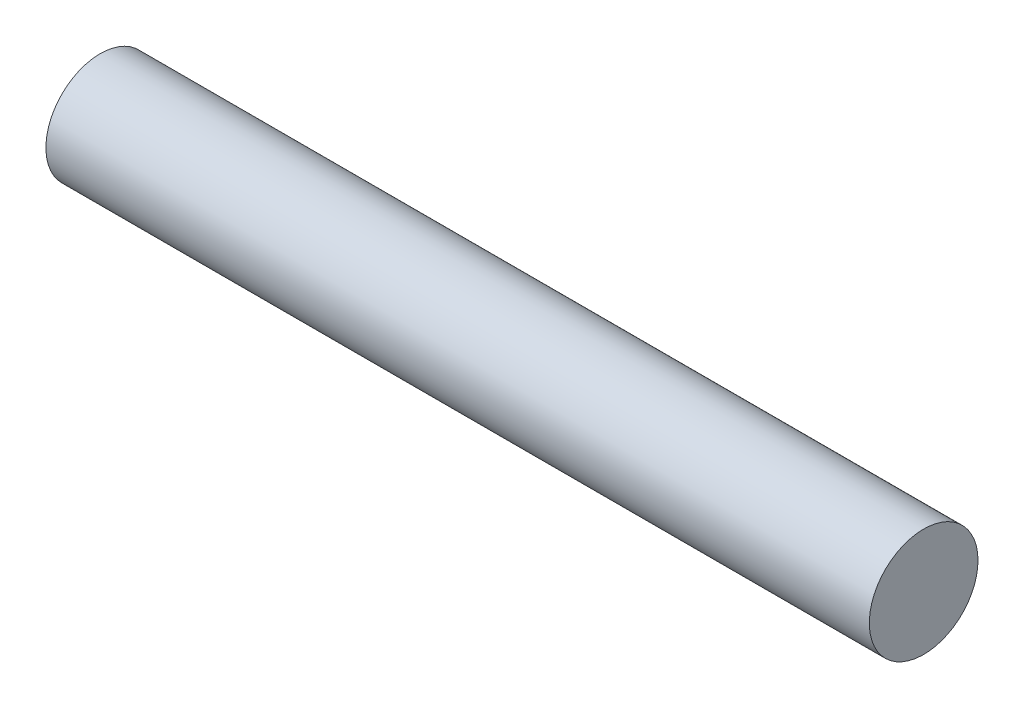
ISO-10303-21;
HEADER;
FILE_DESCRIPTION(('STEP AP214'),'2;1');
FILE_NAME('part.step','',(''),(''),'','','');
FILE_SCHEMA(('AUTOMOTIVE_DESIGN { 1 0 10303 214 1 1 1 1 }'));
ENDSEC;
DATA;
#1=APPLICATION_CONTEXT('core data for automotive mechanical design processes');
#2=APPLICATION_PROTOCOL_DEFINITION('international standard','automotive_design',2000,#1);
#3=PRODUCT_CONTEXT('',#1,'mechanical');
#4=PRODUCT('Part','Part','',(#3));
#5=PRODUCT_RELATED_PRODUCT_CATEGORY('part','',(#4));
#6=PRODUCT_DEFINITION_FORMATION('','',#4);
#7=PRODUCT_DEFINITION_CONTEXT('part definition',#1,'design');
#8=PRODUCT_DEFINITION('design','',#6,#7);
#9=PRODUCT_DEFINITION_SHAPE('','',#8);
#10=(LENGTH_UNIT() NAMED_UNIT(*) SI_UNIT(.MILLI.,.METRE.));
#11=(NAMED_UNIT(*) PLANE_ANGLE_UNIT() SI_UNIT($,.RADIAN.));
#12=(NAMED_UNIT(*) SI_UNIT($,.STERADIAN.) SOLID_ANGLE_UNIT());
#13=UNCERTAINTY_MEASURE_WITH_UNIT(LENGTH_MEASURE(1.E-05),#10,'distance_accuracy_value','');
#14=(GEOMETRIC_REPRESENTATION_CONTEXT(3) GLOBAL_UNCERTAINTY_ASSIGNED_CONTEXT((#13)) GLOBAL_UNIT_ASSIGNED_CONTEXT((#10,
#11,#12)) REPRESENTATION_CONTEXT('',''));
#15=CARTESIAN_POINT('',(0.,0.,0.));
#16=DIRECTION('',(0.,0.,1.));
#17=DIRECTION('',(1.,0.,0.));
#18=AXIS2_PLACEMENT_3D('',#15,#16,#17);
#19=CARTESIAN_POINT('',(25.,0.,0.));
#20=DIRECTION('',(-1.,0.,0.));
#21=DIRECTION('',(0.,0.,1.));
#22=AXIS2_PLACEMENT_3D('',#19,#20,#21);
#23=CYLINDRICAL_SURFACE('',#22,1.65);
#24=CARTESIAN_POINT('',(25.,0.,0.));
#25=DIRECTION('',(1.,0.,0.));
#26=DIRECTION('',(0.,0.,-1.));
#27=AXIS2_PLACEMENT_3D('',#24,#25,#26);
#28=CIRCLE('',#27,1.65);
#29=CARTESIAN_POINT('',(25.,0.,-1.65));
#30=VERTEX_POINT('',#29);
#31=EDGE_CURVE('E10',#30,#30,#28,.T.);
#32=ORIENTED_EDGE('',*,*,#31,.F.);
#33=EDGE_LOOP('',(#32));
#34=FACE_BOUND('',#33,.T.);
#35=CARTESIAN_POINT('',(0.,0.,0.));
#36=DIRECTION('',(1.,0.,0.));
#37=DIRECTION('',(0.,0.,-1.));
#38=AXIS2_PLACEMENT_3D('',#35,#36,#37);
#39=CIRCLE('',#38,1.65);
#40=CARTESIAN_POINT('',(0.,0.,-1.65));
#41=VERTEX_POINT('',#40);
#42=EDGE_CURVE('E35',#41,#41,#39,.T.);
#43=ORIENTED_EDGE('',*,*,#42,.T.);
#44=EDGE_LOOP('',(#43));
#45=FACE_BOUND('',#44,.T.);
#46=ADVANCED_FACE('F32',(#34,#45),#23,.T.);
#47=CARTESIAN_POINT('',(25.,0.,0.));
#48=DIRECTION('',(1.,0.,0.));
#49=DIRECTION('',(0.,0.,-1.));
#50=AXIS2_PLACEMENT_3D('',#47,#48,#49);
#51=PLANE('',#50);
#52=ORIENTED_EDGE('',*,*,#31,.T.);
#53=EDGE_LOOP('',(#52));
#54=FACE_BOUND('',#53,.T.);
#55=ADVANCED_FACE('F47',(#54),#51,.T.);
#56=CARTESIAN_POINT('',(0.,0.,0.));
#57=DIRECTION('',(1.,0.,0.));
#58=DIRECTION('',(0.,0.,-1.));
#59=AXIS2_PLACEMENT_3D('',#56,#57,#58);
#60=PLANE('',#59);
#61=ORIENTED_EDGE('',*,*,#42,.F.);
#62=EDGE_LOOP('',(#61));
#63=FACE_BOUND('',#62,.T.);
#64=ADVANCED_FACE('F45',(#63),#60,.F.);
#65=CLOSED_SHELL('',(#46,#55,#64));
#66=MANIFOLD_SOLID_BREP('B2',#65);
#67=ADVANCED_BREP_SHAPE_REPRESENTATION('',(#18,#66),#14);
#68=SHAPE_DEFINITION_REPRESENTATION(#9,#67);
ENDSEC;
END-ISO-10303-21;
